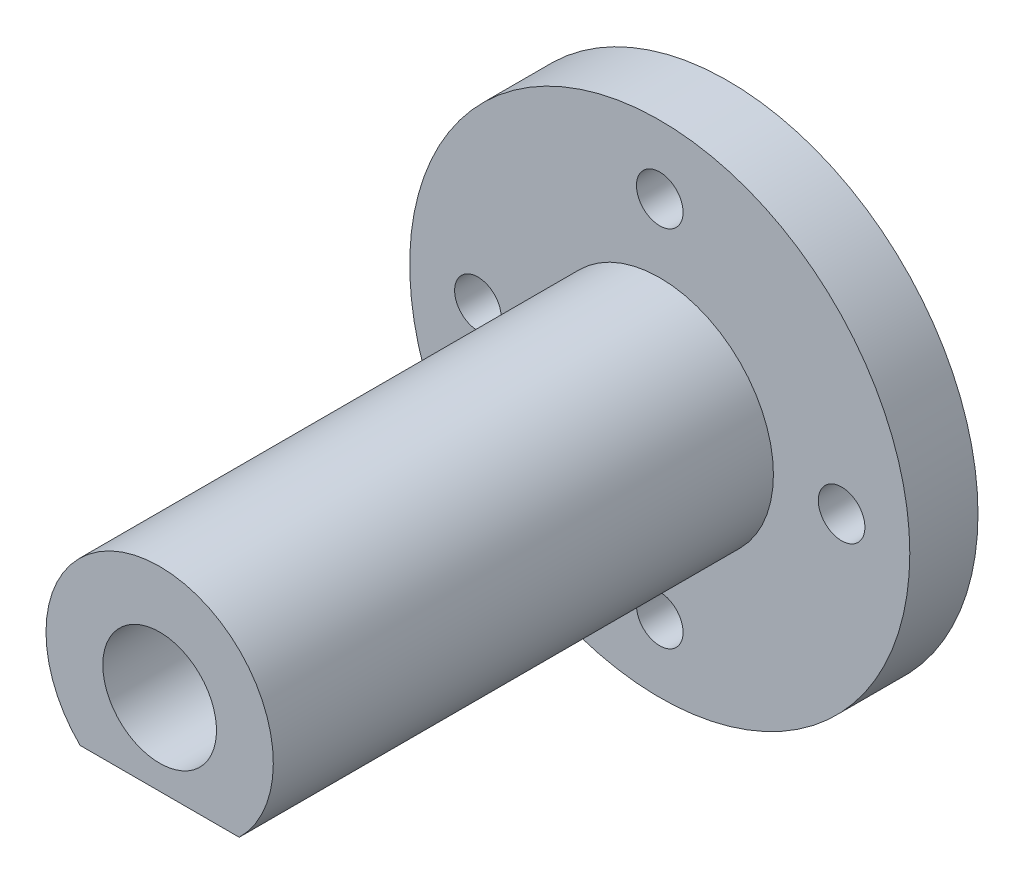
ISO-10303-21;
HEADER;
FILE_DESCRIPTION(('STEP AP214'),'2;1');
FILE_NAME('part.step','',(''),(''),'','','');
FILE_SCHEMA(('AUTOMOTIVE_DESIGN { 1 0 10303 214 1 1 1 1 }'));
ENDSEC;
DATA;
#1=APPLICATION_CONTEXT('core data for automotive mechanical design processes');
#2=APPLICATION_PROTOCOL_DEFINITION('international standard','automotive_design',2000,#1);
#3=PRODUCT_CONTEXT('',#1,'mechanical');
#4=PRODUCT('Part','Part','',(#3));
#5=PRODUCT_RELATED_PRODUCT_CATEGORY('part','',(#4));
#6=PRODUCT_DEFINITION_FORMATION('','',#4);
#7=PRODUCT_DEFINITION_CONTEXT('part definition',#1,'design');
#8=PRODUCT_DEFINITION('design','',#6,#7);
#9=PRODUCT_DEFINITION_SHAPE('','',#8);
#10=(LENGTH_UNIT() NAMED_UNIT(*) SI_UNIT(.MILLI.,.METRE.));
#11=(NAMED_UNIT(*) PLANE_ANGLE_UNIT() SI_UNIT($,.RADIAN.));
#12=(NAMED_UNIT(*) SI_UNIT($,.STERADIAN.) SOLID_ANGLE_UNIT());
#13=UNCERTAINTY_MEASURE_WITH_UNIT(LENGTH_MEASURE(1.E-05),#10,'distance_accuracy_value','');
#14=(GEOMETRIC_REPRESENTATION_CONTEXT(3) GLOBAL_UNCERTAINTY_ASSIGNED_CONTEXT((#13)) GLOBAL_UNIT_ASSIGNED_CONTEXT((#10,
#11,#12)) REPRESENTATION_CONTEXT('',''));
#15=CARTESIAN_POINT('',(0.,0.,0.));
#16=DIRECTION('',(0.,0.,1.));
#17=DIRECTION('',(1.,0.,0.));
#18=AXIS2_PLACEMENT_3D('',#15,#16,#17);
#19=CARTESIAN_POINT('',(0.,0.,3.));
#20=DIRECTION('',(0.,0.,1.));
#21=DIRECTION('',(1.,0.,0.));
#22=AXIS2_PLACEMENT_3D('',#19,#20,#21);
#23=PLANE('',#22);
#24=CARTESIAN_POINT('',(0.,0.,3.));
#25=DIRECTION('',(0.,0.,1.));
#26=DIRECTION('',(1.,0.,0.));
#27=AXIS2_PLACEMENT_3D('',#24,#25,#26);
#28=CIRCLE('',#27,5.);
#29=CARTESIAN_POINT('',(5.,0.,3.));
#30=VERTEX_POINT('',#29);
#31=EDGE_CURVE('E96',#30,#30,#28,.T.);
#32=ORIENTED_EDGE('',*,*,#31,.F.);
#33=EDGE_LOOP('',(#32));
#34=FACE_BOUND('',#33,.T.);
#35=CARTESIAN_POINT('',(8.,0.,3.));
#36=DIRECTION('',(0.,0.,1.));
#37=DIRECTION('',(1.,0.,0.));
#38=AXIS2_PLACEMENT_3D('',#35,#36,#37);
#39=CIRCLE('',#38,1.025);
#40=CARTESIAN_POINT('',(9.025,0.,3.));
#41=VERTEX_POINT('',#40);
#42=EDGE_CURVE('E123',#41,#41,#39,.T.);
#43=ORIENTED_EDGE('',*,*,#42,.F.);
#44=EDGE_LOOP('',(#43));
#45=FACE_BOUND('',#44,.T.);
#46=CARTESIAN_POINT('',(0.,0.,3.));
#47=DIRECTION('',(0.,0.,1.));
#48=DIRECTION('',(1.,0.,0.));
#49=AXIS2_PLACEMENT_3D('',#46,#47,#48);
#50=CIRCLE('',#49,11.);
#51=CARTESIAN_POINT('',(11.,0.,3.));
#52=VERTEX_POINT('',#51);
#53=EDGE_CURVE('E12',#52,#52,#50,.T.);
#54=ORIENTED_EDGE('',*,*,#53,.T.);
#55=EDGE_LOOP('',(#54));
#56=FACE_BOUND('',#55,.T.);
#57=CARTESIAN_POINT('',(-8.,0.,3.));
#58=DIRECTION('',(0.,0.,1.));
#59=DIRECTION('',(1.,0.,0.));
#60=AXIS2_PLACEMENT_3D('',#57,#58,#59);
#61=CIRCLE('',#60,1.025);
#62=CARTESIAN_POINT('',(-6.975,0.,3.));
#63=VERTEX_POINT('',#62);
#64=EDGE_CURVE('E143',#63,#63,#61,.T.);
#65=ORIENTED_EDGE('',*,*,#64,.F.);
#66=EDGE_LOOP('',(#65));
#67=FACE_BOUND('',#66,.T.);
#68=CARTESIAN_POINT('',(0.,8.,3.));
#69=DIRECTION('',(0.,0.,1.));
#70=DIRECTION('',(1.,0.,0.));
#71=AXIS2_PLACEMENT_3D('',#68,#69,#70);
#72=CIRCLE('',#71,1.025);
#73=CARTESIAN_POINT('',(1.025,8.,3.));
#74=VERTEX_POINT('',#73);
#75=EDGE_CURVE('E131',#74,#74,#72,.T.);
#76=ORIENTED_EDGE('',*,*,#75,.F.);
#77=EDGE_LOOP('',(#76));
#78=FACE_BOUND('',#77,.T.);
#79=CARTESIAN_POINT('',(0.,-8.,3.));
#80=DIRECTION('',(0.,0.,1.));
#81=DIRECTION('',(1.,0.,0.));
#82=AXIS2_PLACEMENT_3D('',#79,#80,#81);
#83=CIRCLE('',#82,1.025);
#84=CARTESIAN_POINT('',(1.025,-8.,3.));
#85=VERTEX_POINT('',#84);
#86=EDGE_CURVE('E115',#85,#85,#83,.T.);
#87=ORIENTED_EDGE('',*,*,#86,.F.);
#88=EDGE_LOOP('',(#87));
#89=FACE_BOUND('',#88,.T.);
#90=ADVANCED_FACE('F49',(#34,#45,#56,#67,#78,#89),#23,.T.);
#91=CARTESIAN_POINT('',(0.,0.,0.));
#92=DIRECTION('',(0.,0.,1.));
#93=DIRECTION('',(1.,0.,0.));
#94=AXIS2_PLACEMENT_3D('',#91,#92,#93);
#95=PLANE('',#94);
#96=CARTESIAN_POINT('',(0.,0.,0.));
#97=DIRECTION('',(0.,0.,1.));
#98=DIRECTION('',(1.,0.,0.));
#99=AXIS2_PLACEMENT_3D('',#96,#97,#98);
#100=CIRCLE('',#99,11.);
#101=CARTESIAN_POINT('',(11.,0.,0.));
#102=VERTEX_POINT('',#101);
#103=EDGE_CURVE('E53',#102,#102,#100,.T.);
#104=ORIENTED_EDGE('',*,*,#103,.F.);
#105=EDGE_LOOP('',(#104));
#106=FACE_BOUND('',#105,.T.);
#107=CARTESIAN_POINT('',(-8.,0.,0.));
#108=DIRECTION('',(0.,0.,1.));
#109=DIRECTION('',(1.,0.,0.));
#110=AXIS2_PLACEMENT_3D('',#107,#108,#109);
#111=CIRCLE('',#110,1.025);
#112=CARTESIAN_POINT('',(-6.975,0.,0.));
#113=VERTEX_POINT('',#112);
#114=EDGE_CURVE('E142',#113,#113,#111,.T.);
#115=ORIENTED_EDGE('',*,*,#114,.T.);
#116=EDGE_LOOP('',(#115));
#117=FACE_BOUND('',#116,.T.);
#118=CARTESIAN_POINT('',(0.,0.,0.));
#119=DIRECTION('',(0.,0.,1.));
#120=DIRECTION('',(1.,0.,0.));
#121=AXIS2_PLACEMENT_3D('',#118,#119,#120);
#122=CIRCLE('',#121,4.25);
#123=CARTESIAN_POINT('',(4.25,0.,0.));
#124=VERTEX_POINT('',#123);
#125=EDGE_CURVE('E135',#124,#124,#122,.T.);
#126=ORIENTED_EDGE('',*,*,#125,.T.);
#127=EDGE_LOOP('',(#126));
#128=FACE_BOUND('',#127,.T.);
#129=CARTESIAN_POINT('',(0.,8.,0.));
#130=DIRECTION('',(0.,0.,1.));
#131=DIRECTION('',(1.,0.,0.));
#132=AXIS2_PLACEMENT_3D('',#129,#130,#131);
#133=CIRCLE('',#132,1.025);
#134=CARTESIAN_POINT('',(1.025,8.,0.));
#135=VERTEX_POINT('',#134);
#136=EDGE_CURVE('E127',#135,#135,#133,.T.);
#137=ORIENTED_EDGE('',*,*,#136,.T.);
#138=EDGE_LOOP('',(#137));
#139=FACE_BOUND('',#138,.T.);
#140=CARTESIAN_POINT('',(8.,0.,0.));
#141=DIRECTION('',(0.,0.,1.));
#142=DIRECTION('',(1.,0.,0.));
#143=AXIS2_PLACEMENT_3D('',#140,#141,#142);
#144=CIRCLE('',#143,1.025);
#145=CARTESIAN_POINT('',(9.025,0.,0.));
#146=VERTEX_POINT('',#145);
#147=EDGE_CURVE('E119',#146,#146,#144,.T.);
#148=ORIENTED_EDGE('',*,*,#147,.T.);
#149=EDGE_LOOP('',(#148));
#150=FACE_BOUND('',#149,.T.);
#151=CARTESIAN_POINT('',(0.,-8.,0.));
#152=DIRECTION('',(0.,0.,1.));
#153=DIRECTION('',(1.,0.,0.));
#154=AXIS2_PLACEMENT_3D('',#151,#152,#153);
#155=CIRCLE('',#154,1.025);
#156=CARTESIAN_POINT('',(1.025,-8.,0.));
#157=VERTEX_POINT('',#156);
#158=EDGE_CURVE('E102',#157,#157,#155,.T.);
#159=ORIENTED_EDGE('',*,*,#158,.T.);
#160=EDGE_LOOP('',(#159));
#161=FACE_BOUND('',#160,.T.);
#162=ADVANCED_FACE('F152',(#106,#117,#128,#139,#150,#161),#95,.F.);
#163=CARTESIAN_POINT('',(0.,0.,3.));
#164=DIRECTION('',(0.,0.,-1.));
#165=DIRECTION('',(-1.,0.,0.));
#166=AXIS2_PLACEMENT_3D('',#163,#164,#165);
#167=CYLINDRICAL_SURFACE('',#166,11.);
#168=ORIENTED_EDGE('',*,*,#53,.F.);
#169=EDGE_LOOP('',(#168));
#170=FACE_BOUND('',#169,.T.);
#171=ORIENTED_EDGE('',*,*,#103,.T.);
#172=EDGE_LOOP('',(#171));
#173=FACE_BOUND('',#172,.T.);
#174=ADVANCED_FACE('F51',(#170,#173),#167,.T.);
#175=CARTESIAN_POINT('',(-8.,0.,3.));
#176=DIRECTION('',(0.,0.,-1.));
#177=DIRECTION('',(-1.,0.,0.));
#178=AXIS2_PLACEMENT_3D('',#175,#176,#177);
#179=CYLINDRICAL_SURFACE('',#178,1.025);
#180=ORIENTED_EDGE('',*,*,#64,.T.);
#181=EDGE_LOOP('',(#180));
#182=FACE_BOUND('',#181,.T.);
#183=ORIENTED_EDGE('',*,*,#114,.F.);
#184=EDGE_LOOP('',(#183));
#185=FACE_BOUND('',#184,.T.);
#186=ADVANCED_FACE('F155',(#182,#185),#179,.F.);
#187=CARTESIAN_POINT('',(0.,0.,3.));
#188=DIRECTION('',(0.,0.,-1.));
#189=DIRECTION('',(-1.,0.,0.));
#190=AXIS2_PLACEMENT_3D('',#187,#188,#189);
#191=CYLINDRICAL_SURFACE('',#190,4.25);
#192=CARTESIAN_POINT('',(0.,0.,3.));
#193=DIRECTION('',(0.,0.,1.));
#194=DIRECTION('',(1.,0.,0.));
#195=AXIS2_PLACEMENT_3D('',#192,#193,#194);
#196=CIRCLE('',#195,4.25);
#197=CARTESIAN_POINT('',(4.25,0.,3.));
#198=VERTEX_POINT('',#197);
#199=EDGE_CURVE('E95',#198,#198,#196,.T.);
#200=ORIENTED_EDGE('',*,*,#199,.T.);
#201=EDGE_LOOP('',(#200));
#202=FACE_BOUND('',#201,.T.);
#203=ORIENTED_EDGE('',*,*,#125,.F.);
#204=EDGE_LOOP('',(#203));
#205=FACE_BOUND('',#204,.T.);
#206=ADVANCED_FACE('F157',(#202,#205),#191,.F.);
#207=CARTESIAN_POINT('',(0.,8.,3.));
#208=DIRECTION('',(0.,0.,-1.));
#209=DIRECTION('',(-1.,0.,0.));
#210=AXIS2_PLACEMENT_3D('',#207,#208,#209);
#211=CYLINDRICAL_SURFACE('',#210,1.025);
#212=ORIENTED_EDGE('',*,*,#75,.T.);
#213=EDGE_LOOP('',(#212));
#214=FACE_BOUND('',#213,.T.);
#215=ORIENTED_EDGE('',*,*,#136,.F.);
#216=EDGE_LOOP('',(#215));
#217=FACE_BOUND('',#216,.T.);
#218=ADVANCED_FACE('F164',(#214,#217),#211,.F.);
#219=CARTESIAN_POINT('',(8.,0.,3.));
#220=DIRECTION('',(0.,0.,-1.));
#221=DIRECTION('',(-1.,0.,0.));
#222=AXIS2_PLACEMENT_3D('',#219,#220,#221);
#223=CYLINDRICAL_SURFACE('',#222,1.025);
#224=ORIENTED_EDGE('',*,*,#42,.T.);
#225=EDGE_LOOP('',(#224));
#226=FACE_BOUND('',#225,.T.);
#227=ORIENTED_EDGE('',*,*,#147,.F.);
#228=EDGE_LOOP('',(#227));
#229=FACE_BOUND('',#228,.T.);
#230=ADVANCED_FACE('F192',(#226,#229),#223,.F.);
#231=CARTESIAN_POINT('',(0.,-8.,3.));
#232=DIRECTION('',(0.,0.,-1.));
#233=DIRECTION('',(-1.,0.,0.));
#234=AXIS2_PLACEMENT_3D('',#231,#232,#233);
#235=CYLINDRICAL_SURFACE('',#234,1.025);
#236=ORIENTED_EDGE('',*,*,#86,.T.);
#237=EDGE_LOOP('',(#236));
#238=FACE_BOUND('',#237,.T.);
#239=ORIENTED_EDGE('',*,*,#158,.F.);
#240=EDGE_LOOP('',(#239));
#241=FACE_BOUND('',#240,.T.);
#242=ADVANCED_FACE('F189',(#238,#241),#235,.F.);
#243=CARTESIAN_POINT('',(0.,0.,3.));
#244=DIRECTION('',(0.,0.,1.));
#245=DIRECTION('',(1.,0.,0.));
#246=AXIS2_PLACEMENT_3D('',#243,#244,#245);
#247=PLANE('',#246);
#248=CARTESIAN_POINT('',(0.,0.,3.));
#249=DIRECTION('',(0.,0.,1.));
#250=DIRECTION('',(1.,0.,0.));
#251=AXIS2_PLACEMENT_3D('',#248,#249,#250);
#252=CIRCLE('',#251,2.5);
#253=CARTESIAN_POINT('',(-2.5,0.,3.));
#254=VERTEX_POINT('',#253);
#255=EDGE_CURVE('E105',#254,#254,#252,.T.);
#256=ORIENTED_EDGE('',*,*,#255,.T.);
#257=EDGE_LOOP('',(#256));
#258=FACE_BOUND('',#257,.T.);
#259=ORIENTED_EDGE('',*,*,#199,.F.);
#260=EDGE_LOOP('',(#259));
#261=FACE_BOUND('',#260,.T.);
#262=ADVANCED_FACE('F191',(#258,#261),#247,.F.);
#263=CARTESIAN_POINT('',(0.,0.,64.142135623731));
#264=DIRECTION('',(0.,0.,-1.));
#265=DIRECTION('',(-1.,0.,0.));
#266=AXIS2_PLACEMENT_3D('',#263,#264,#265);
#267=CYLINDRICAL_SURFACE('',#266,5.);
#268=CARTESIAN_POINT('',(0.,0.,25.));
#269=DIRECTION('',(0.,0.,1.));
#270=DIRECTION('',(1.,0.,0.));
#271=AXIS2_PLACEMENT_3D('',#268,#269,#270);
#272=CIRCLE('',#271,5.);
#273=CARTESIAN_POINT('',(3.5,-3.57071421427143,25.));
#274=VERTEX_POINT('',#273);
#275=CARTESIAN_POINT('',(-3.5,-3.57071421427143,25.));
#276=VERTEX_POINT('',#275);
#277=EDGE_CURVE('E88',#274,#276,#272,.T.);
#278=ORIENTED_EDGE('',*,*,#277,.F.);
#279=DIRECTION('',(0.,0.,1.));
#280=VECTOR('',#279,1.);
#281=CARTESIAN_POINT('',(3.5,-3.57071421427143,15.));
#282=LINE('',#281,#280);
#283=CARTESIAN_POINT('',(3.5,-3.57071421427143,15.));
#284=VERTEX_POINT('',#283);
#285=EDGE_CURVE('E65',#284,#274,#282,.T.);
#286=ORIENTED_EDGE('',*,*,#285,.F.);
#287=CARTESIAN_POINT('',(0.,0.,15.));
#288=DIRECTION('',(0.,0.,1.));
#289=DIRECTION('',(1.,0.,0.));
#290=AXIS2_PLACEMENT_3D('',#287,#288,#289);
#291=CIRCLE('',#290,5.);
#292=CARTESIAN_POINT('',(-3.5,-3.57071421427143,15.));
#293=VERTEX_POINT('',#292);
#294=EDGE_CURVE('E82',#293,#284,#291,.T.);
#295=ORIENTED_EDGE('',*,*,#294,.F.);
#296=DIRECTION('',(0.,0.,1.));
#297=VECTOR('',#296,1.);
#298=CARTESIAN_POINT('',(-3.5,-3.57071421427143,15.));
#299=LINE('',#298,#297);
#300=EDGE_CURVE('E71',#293,#276,#299,.T.);
#301=ORIENTED_EDGE('',*,*,#300,.T.);
#302=EDGE_LOOP('',(#278,#286,#295,#301));
#303=FACE_BOUND('',#302,.T.);
#304=ORIENTED_EDGE('',*,*,#31,.T.);
#305=EDGE_LOOP('',(#304));
#306=FACE_BOUND('',#305,.T.);
#307=ADVANCED_FACE('F86',(#303,#306),#267,.T.);
#308=CARTESIAN_POINT('',(0.,0.,64.142135623731));
#309=DIRECTION('',(0.,0.,-1.));
#310=DIRECTION('',(-1.,0.,0.));
#311=AXIS2_PLACEMENT_3D('',#308,#309,#310);
#312=CYLINDRICAL_SURFACE('',#311,2.5);
#313=CARTESIAN_POINT('',(0.,0.,25.));
#314=DIRECTION('',(0.,0.,1.));
#315=DIRECTION('',(1.,0.,0.));
#316=AXIS2_PLACEMENT_3D('',#313,#314,#315);
#317=CIRCLE('',#316,2.5);
#318=CARTESIAN_POINT('',(-2.5,0.,25.));
#319=VERTEX_POINT('',#318);
#320=EDGE_CURVE('E90',#319,#319,#317,.T.);
#321=CARTESIAN_POINT('',(-2.5,0.,3.));
#322=CARTESIAN_POINT('',(-2.5,0.,3.22916666666666));
#323=CARTESIAN_POINT('',(-2.5,0.,3.45833333333333));
#324=CARTESIAN_POINT('',(-2.5,0.,3.91666666666666));
#325=CARTESIAN_POINT('',(-2.5,0.,4.14583333333333));
#326=CARTESIAN_POINT('',(-2.5,0.,4.60416666666666));
#327=CARTESIAN_POINT('',(-2.5,0.,4.83333333333333));
#328=CARTESIAN_POINT('',(-2.5,0.,5.29166666666666));
#329=CARTESIAN_POINT('',(-2.5,0.,5.52083333333333));
#330=CARTESIAN_POINT('',(-2.5,0.,5.97916666666667));
#331=CARTESIAN_POINT('',(-2.5,0.,6.20833333333333));
#332=CARTESIAN_POINT('',(-2.5,0.,6.66666666666667));
#333=CARTESIAN_POINT('',(-2.5,0.,6.89583333333333));
#334=CARTESIAN_POINT('',(-2.5,0.,7.35416666666666));
#335=CARTESIAN_POINT('',(-2.5,0.,7.58333333333333));
#336=CARTESIAN_POINT('',(-2.5,0.,8.04166666666666));
#337=CARTESIAN_POINT('',(-2.5,0.,8.27083333333333));
#338=CARTESIAN_POINT('',(-2.5,0.,8.72916666666666));
#339=CARTESIAN_POINT('',(-2.5,0.,8.95833333333333));
#340=CARTESIAN_POINT('',(-2.5,0.,9.41666666666666));
#341=CARTESIAN_POINT('',(-2.5,0.,9.64583333333333));
#342=CARTESIAN_POINT('',(-2.5,0.,10.1041666666667));
#343=CARTESIAN_POINT('',(-2.5,0.,10.3333333333333));
#344=CARTESIAN_POINT('',(-2.5,0.,10.7916666666667));
#345=CARTESIAN_POINT('',(-2.5,0.,11.0208333333333));
#346=CARTESIAN_POINT('',(-2.5,0.,11.4791666666667));
#347=CARTESIAN_POINT('',(-2.5,0.,11.7083333333333));
#348=CARTESIAN_POINT('',(-2.5,0.,12.1666666666667));
#349=CARTESIAN_POINT('',(-2.5,0.,12.3958333333333));
#350=CARTESIAN_POINT('',(-2.5,0.,12.8541666666667));
#351=CARTESIAN_POINT('',(-2.5,0.,13.0833333333333));
#352=CARTESIAN_POINT('',(-2.5,0.,13.5416666666667));
#353=CARTESIAN_POINT('',(-2.5,0.,13.7708333333333));
#354=CARTESIAN_POINT('',(-2.5,0.,14.2291666666667));
#355=CARTESIAN_POINT('',(-2.5,0.,14.4583333333333));
#356=CARTESIAN_POINT('',(-2.5,0.,14.9166666666667));
#357=CARTESIAN_POINT('',(-2.5,0.,15.1458333333333));
#358=CARTESIAN_POINT('',(-2.5,0.,15.6041666666667));
#359=CARTESIAN_POINT('',(-2.5,0.,15.8333333333333));
#360=CARTESIAN_POINT('',(-2.5,0.,16.2916666666667));
#361=CARTESIAN_POINT('',(-2.5,0.,16.5208333333333));
#362=CARTESIAN_POINT('',(-2.5,0.,16.9791666666667));
#363=CARTESIAN_POINT('',(-2.5,0.,17.2083333333333));
#364=CARTESIAN_POINT('',(-2.5,0.,17.6666666666667));
#365=CARTESIAN_POINT('',(-2.5,0.,17.8958333333333));
#366=CARTESIAN_POINT('',(-2.5,0.,18.3541666666667));
#367=CARTESIAN_POINT('',(-2.5,0.,18.5833333333333));
#368=CARTESIAN_POINT('',(-2.5,0.,19.0416666666667));
#369=CARTESIAN_POINT('',(-2.5,0.,19.2708333333333));
#370=CARTESIAN_POINT('',(-2.5,0.,19.7291666666667));
#371=CARTESIAN_POINT('',(-2.5,0.,19.9583333333333));
#372=CARTESIAN_POINT('',(-2.5,0.,20.4166666666667));
#373=CARTESIAN_POINT('',(-2.5,0.,20.6458333333333));
#374=CARTESIAN_POINT('',(-2.5,0.,21.1041666666667));
#375=CARTESIAN_POINT('',(-2.5,0.,21.3333333333333));
#376=CARTESIAN_POINT('',(-2.5,0.,21.7916666666667));
#377=CARTESIAN_POINT('',(-2.5,0.,22.0208333333333));
#378=CARTESIAN_POINT('',(-2.5,0.,22.4791666666667));
#379=CARTESIAN_POINT('',(-2.5,0.,22.7083333333333));
#380=CARTESIAN_POINT('',(-2.5,0.,23.1666666666667));
#381=CARTESIAN_POINT('',(-2.5,0.,23.3958333333333));
#382=CARTESIAN_POINT('',(-2.5,0.,23.8541666666667));
#383=CARTESIAN_POINT('',(-2.5,0.,24.0833333333333));
#384=CARTESIAN_POINT('',(-2.5,0.,24.5416666666667));
#385=CARTESIAN_POINT('',(-2.5,0.,24.7708333333333));
#386=CARTESIAN_POINT('',(-2.5,0.,25.));
#387=B_SPLINE_CURVE_WITH_KNOTS('',3,(#321,#322,#323,#324,#325,#326,#327,#328,#329,#330,#331,
#332,#333,#334,#335,#336,#337,#338,#339,#340,#341,#342,#343,#344,#345,#346,#347,#348,#349,#350,
#351,#352,#353,#354,#355,#356,#357,#358,#359,#360,#361,#362,#363,#364,#365,#366,#367,#368,#369,
#370,#371,#372,#373,#374,#375,#376,#377,#378,#379,#380,#381,#382,#383,#384,#385,#386),
.UNSPECIFIED.,.F.,.F.,(4,2,2,2,2,2,2,2,2,2,2,2,2,2,2,2,2,2,2,2,2,2,2,2,2,2,2,2,2,2,2,2,4),(0.,
0.687500000000001,1.375,2.0625,2.75,3.4375,4.125,4.8125,5.50000000000001,6.1875,6.875,7.5625,
8.25,8.9375,9.625,10.3125,11.,11.6875,12.375,13.0625,13.75,14.4375,15.125,15.8125,16.5,17.1875,
17.875,18.5625,19.25,19.9375,20.625,21.3125,22.),.UNSPECIFIED.);
#388=EDGE_CURVE('BSEAM243',#254,#319,#387,.T.);
#389=ORIENTED_EDGE('',*,*,#255,.F.);
#390=ORIENTED_EDGE('',*,*,#320,.T.);
#391=ORIENTED_EDGE('',*,*,#388,.T.);
#392=ORIENTED_EDGE('',*,*,#388,.F.);
#393=EDGE_LOOP('',(#389,#391,#390,#392));
#394=FACE_BOUND('',#393,.T.);
#395=ADVANCED_FACE('F243',(#394),#312,.F.);
#396=CARTESIAN_POINT('',(0.,0.,25.));
#397=DIRECTION('',(0.,0.,1.));
#398=DIRECTION('',(1.,0.,0.));
#399=AXIS2_PLACEMENT_3D('',#396,#397,#398);
#400=PLANE('',#399);
#401=DIRECTION('',(-1.,0.,0.));
#402=VECTOR('',#401,1.);
#403=CARTESIAN_POINT('',(3.5,-3.57071421427143,25.));
#404=LINE('',#403,#402);
#405=EDGE_CURVE('E76',#274,#276,#404,.T.);
#406=ORIENTED_EDGE('',*,*,#405,.F.);
#407=ORIENTED_EDGE('',*,*,#277,.T.);
#408=EDGE_LOOP('',(#406,#407));
#409=FACE_BOUND('',#408,.T.);
#410=ORIENTED_EDGE('',*,*,#320,.F.);
#411=EDGE_LOOP('',(#410));
#412=FACE_BOUND('',#411,.T.);
#413=ADVANCED_FACE('F92',(#409,#412),#400,.T.);
#414=CARTESIAN_POINT('',(3.5,-3.57071421427143,15.));
#415=DIRECTION('',(0.,1.,0.));
#416=DIRECTION('',(0.,0.,1.));
#417=AXIS2_PLACEMENT_3D('',#414,#415,#416);
#418=PLANE('',#417);
#419=ORIENTED_EDGE('',*,*,#405,.T.);
#420=ORIENTED_EDGE('',*,*,#300,.F.);
#421=DIRECTION('',(-1.,0.,0.));
#422=VECTOR('',#421,1.);
#423=CARTESIAN_POINT('',(3.5,-3.57071421427143,15.));
#424=LINE('',#423,#422);
#425=EDGE_CURVE('E279',#284,#293,#424,.T.);
#426=ORIENTED_EDGE('',*,*,#425,.F.);
#427=ORIENTED_EDGE('',*,*,#285,.T.);
#428=EDGE_LOOP('',(#419,#420,#426,#427));
#429=FACE_BOUND('',#428,.T.);
#430=ADVANCED_FACE('F77',(#429),#418,.F.);
#431=CARTESIAN_POINT('',(0.,0.,15.));
#432=DIRECTION('',(0.,0.,1.));
#433=DIRECTION('',(1.,0.,0.));
#434=AXIS2_PLACEMENT_3D('',#431,#432,#433);
#435=PLANE('',#434);
#436=ORIENTED_EDGE('',*,*,#294,.T.);
#437=ORIENTED_EDGE('',*,*,#425,.T.);
#438=EDGE_LOOP('',(#436,#437));
#439=FACE_BOUND('',#438,.T.);
#440=ADVANCED_FACE('F267',(#439),#435,.T.);
#441=CLOSED_SHELL('',(#90,#162,#174,#186,#206,#218,#230,#242,#262,#307,#395,#413,#430,#440));
#442=MANIFOLD_SOLID_BREP('B2',#441);
#443=ADVANCED_BREP_SHAPE_REPRESENTATION('',(#18,#442),#14);
#444=SHAPE_DEFINITION_REPRESENTATION(#9,#443);
ENDSEC;
END-ISO-10303-21;
